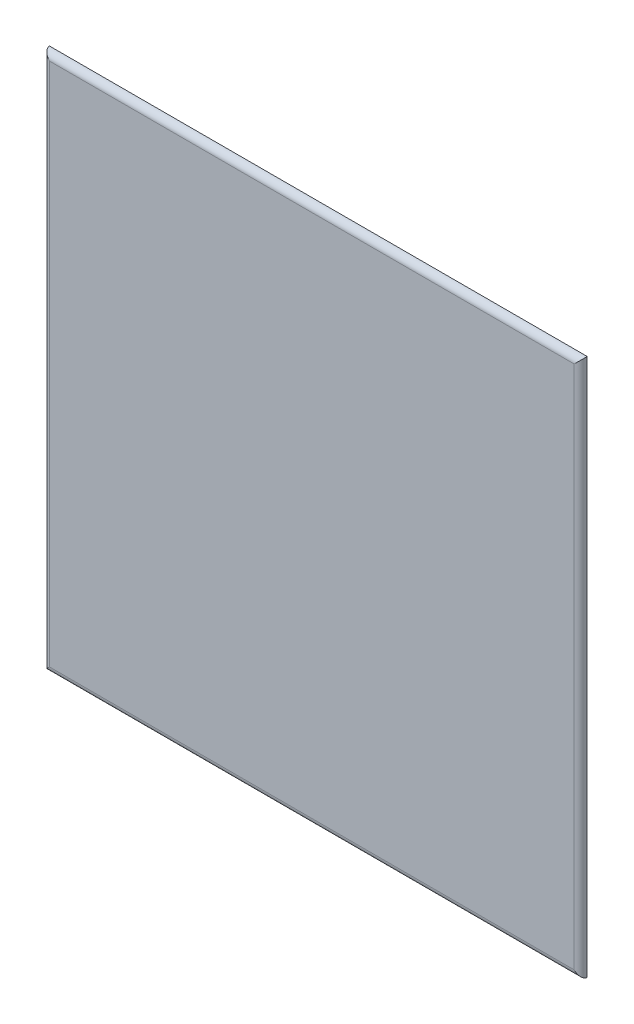
ISO-10303-21;
HEADER;
FILE_DESCRIPTION(('STEP AP214'),'2;1');
FILE_NAME('part.step','',(''),(''),'','','');
FILE_SCHEMA(('AUTOMOTIVE_DESIGN { 1 0 10303 214 1 1 1 1 }'));
ENDSEC;
DATA;
#1=APPLICATION_CONTEXT('core data for automotive mechanical design processes');
#2=APPLICATION_PROTOCOL_DEFINITION('international standard','automotive_design',2000,#1);
#3=PRODUCT_CONTEXT('',#1,'mechanical');
#4=PRODUCT('Part','Part','',(#3));
#5=PRODUCT_RELATED_PRODUCT_CATEGORY('part','',(#4));
#6=PRODUCT_DEFINITION_FORMATION('','',#4);
#7=PRODUCT_DEFINITION_CONTEXT('part definition',#1,'design');
#8=PRODUCT_DEFINITION('design','',#6,#7);
#9=PRODUCT_DEFINITION_SHAPE('','',#8);
#10=(LENGTH_UNIT() NAMED_UNIT(*) SI_UNIT(.MILLI.,.METRE.));
#11=(NAMED_UNIT(*) PLANE_ANGLE_UNIT() SI_UNIT($,.RADIAN.));
#12=(NAMED_UNIT(*) SI_UNIT($,.STERADIAN.) SOLID_ANGLE_UNIT());
#13=UNCERTAINTY_MEASURE_WITH_UNIT(LENGTH_MEASURE(1.E-05),#10,'distance_accuracy_value','');
#14=(GEOMETRIC_REPRESENTATION_CONTEXT(3) GLOBAL_UNCERTAINTY_ASSIGNED_CONTEXT((#13)) GLOBAL_UNIT_ASSIGNED_CONTEXT((#10,
#11,#12)) REPRESENTATION_CONTEXT('',''));
#15=CARTESIAN_POINT('',(0.,0.,0.));
#16=DIRECTION('',(0.,0.,1.));
#17=DIRECTION('',(1.,0.,0.));
#18=AXIS2_PLACEMENT_3D('',#15,#16,#17);
#19=CARTESIAN_POINT('',(74.75,-74.75,3.));
#20=DIRECTION('',(-1.,0.,0.));
#21=DIRECTION('',(0.,0.,1.));
#22=AXIS2_PLACEMENT_3D('',#19,#20,#21);
#23=PLANE('',#22);
#24=DIRECTION('',(0.,1.,0.));
#25=VECTOR('',#24,1.);
#26=CARTESIAN_POINT('',(74.75,-74.75,0.));
#27=LINE('',#26,#25);
#28=CARTESIAN_POINT('',(74.75,-73.75,0.));
#29=VERTEX_POINT('',#28);
#30=CARTESIAN_POINT('',(74.75,73.75,0.));
#31=VERTEX_POINT('',#30);
#32=EDGE_CURVE('E152',#29,#31,#27,.T.);
#33=ORIENTED_EDGE('',*,*,#32,.T.);
#34=DIRECTION('',(0.,0.,-1.));
#35=VECTOR('',#34,1.);
#36=CARTESIAN_POINT('',(74.75,73.75,3.));
#37=LINE('',#36,#35);
#38=CARTESIAN_POINT('',(74.75,73.75,3.));
#39=VERTEX_POINT('',#38);
#40=EDGE_CURVE('E193',#31,#39,#37,.F.);
#41=ORIENTED_EDGE('',*,*,#40,.T.);
#42=DIRECTION('',(0.,1.,0.));
#43=VECTOR('',#42,1.);
#44=CARTESIAN_POINT('',(74.75,-74.75,3.));
#45=LINE('',#44,#43);
#46=CARTESIAN_POINT('',(74.75,-73.75,3.));
#47=VERTEX_POINT('',#46);
#48=EDGE_CURVE('E158',#47,#39,#45,.T.);
#49=ORIENTED_EDGE('',*,*,#48,.F.);
#50=DIRECTION('',(0.,0.,-1.));
#51=VECTOR('',#50,1.);
#52=CARTESIAN_POINT('',(74.75,-73.75,3.));
#53=LINE('',#52,#51);
#54=EDGE_CURVE('E195',#47,#29,#53,.T.);
#55=ORIENTED_EDGE('',*,*,#54,.T.);
#56=EDGE_LOOP('',(#33,#41,#49,#55));
#57=FACE_BOUND('',#56,.T.);
#58=ADVANCED_FACE('F41',(#57),#23,.F.);
#59=CARTESIAN_POINT('',(-74.75,74.75,3.));
#60=DIRECTION('',(0.,-1.,0.));
#61=DIRECTION('',(0.,0.,-1.));
#62=AXIS2_PLACEMENT_3D('',#59,#60,#61);
#63=PLANE('',#62);
#64=DIRECTION('',(-1.,0.,0.));
#65=VECTOR('',#64,1.);
#66=CARTESIAN_POINT('',(-74.75,74.75,3.));
#67=LINE('',#66,#65);
#68=CARTESIAN_POINT('',(73.75,74.75,3.));
#69=VERTEX_POINT('',#68);
#70=CARTESIAN_POINT('',(-73.75,74.75,3.));
#71=VERTEX_POINT('',#70);
#72=EDGE_CURVE('E159',#69,#71,#67,.T.);
#73=ORIENTED_EDGE('',*,*,#72,.F.);
#74=DIRECTION('',(0.,0.,-1.));
#75=VECTOR('',#74,1.);
#76=CARTESIAN_POINT('',(73.75,74.75,3.));
#77=LINE('',#76,#75);
#78=CARTESIAN_POINT('',(73.75,74.75,0.));
#79=VERTEX_POINT('',#78);
#80=EDGE_CURVE('E181',#69,#79,#77,.T.);
#81=ORIENTED_EDGE('',*,*,#80,.T.);
#82=DIRECTION('',(-1.,0.,0.));
#83=VECTOR('',#82,1.);
#84=CARTESIAN_POINT('',(-74.75,74.75,0.));
#85=LINE('',#84,#83);
#86=CARTESIAN_POINT('',(-73.75,74.75,0.));
#87=VERTEX_POINT('',#86);
#88=EDGE_CURVE('E175',#79,#87,#85,.T.);
#89=ORIENTED_EDGE('',*,*,#88,.T.);
#90=DIRECTION('',(0.,0.,-1.));
#91=VECTOR('',#90,1.);
#92=CARTESIAN_POINT('',(-73.75,74.75,3.));
#93=LINE('',#92,#91);
#94=EDGE_CURVE('E169',#87,#71,#93,.F.);
#95=ORIENTED_EDGE('',*,*,#94,.T.);
#96=EDGE_LOOP('',(#73,#81,#89,#95));
#97=FACE_BOUND('',#96,.T.);
#98=ADVANCED_FACE('F231',(#97),#63,.F.);
#99=CARTESIAN_POINT('',(-74.75,-74.75,3.));
#100=DIRECTION('',(1.,0.,0.));
#101=DIRECTION('',(0.,0.,-1.));
#102=AXIS2_PLACEMENT_3D('',#99,#100,#101);
#103=PLANE('',#102);
#104=DIRECTION('',(0.,-1.,0.));
#105=VECTOR('',#104,1.);
#106=CARTESIAN_POINT('',(-74.75,-74.75,3.));
#107=LINE('',#106,#105);
#108=CARTESIAN_POINT('',(-74.75,73.75,3.));
#109=VERTEX_POINT('',#108);
#110=CARTESIAN_POINT('',(-74.75,-73.75,3.));
#111=VERTEX_POINT('',#110);
#112=EDGE_CURVE('E161',#109,#111,#107,.T.);
#113=ORIENTED_EDGE('',*,*,#112,.F.);
#114=DIRECTION('',(0.,0.,-1.));
#115=VECTOR('',#114,1.);
#116=CARTESIAN_POINT('',(-74.75,73.75,3.));
#117=LINE('',#116,#115);
#118=CARTESIAN_POINT('',(-74.75,73.75,0.));
#119=VERTEX_POINT('',#118);
#120=EDGE_CURVE('E198',#109,#119,#117,.T.);
#121=ORIENTED_EDGE('',*,*,#120,.T.);
#122=DIRECTION('',(0.,-1.,0.));
#123=VECTOR('',#122,1.);
#124=CARTESIAN_POINT('',(-74.75,-74.75,0.));
#125=LINE('',#124,#123);
#126=CARTESIAN_POINT('',(-74.75,-73.75,0.));
#127=VERTEX_POINT('',#126);
#128=EDGE_CURVE('E174',#119,#127,#125,.T.);
#129=ORIENTED_EDGE('',*,*,#128,.T.);
#130=DIRECTION('',(0.,0.,-1.));
#131=VECTOR('',#130,1.);
#132=CARTESIAN_POINT('',(-74.75,-73.75,3.));
#133=LINE('',#132,#131);
#134=EDGE_CURVE('E196',#127,#111,#133,.F.);
#135=ORIENTED_EDGE('',*,*,#134,.T.);
#136=EDGE_LOOP('',(#113,#121,#129,#135));
#137=FACE_BOUND('',#136,.T.);
#138=ADVANCED_FACE('F237',(#137),#103,.F.);
#139=CARTESIAN_POINT('',(-74.75,-74.75,3.));
#140=DIRECTION('',(0.,1.,0.));
#141=DIRECTION('',(0.,0.,1.));
#142=AXIS2_PLACEMENT_3D('',#139,#140,#141);
#143=PLANE('',#142);
#144=DIRECTION('',(1.,0.,0.));
#145=VECTOR('',#144,1.);
#146=CARTESIAN_POINT('',(-74.75,-74.75,3.));
#147=LINE('',#146,#145);
#148=CARTESIAN_POINT('',(-73.75,-74.75,3.));
#149=VERTEX_POINT('',#148);
#150=CARTESIAN_POINT('',(73.75,-74.75,3.));
#151=VERTEX_POINT('',#150);
#152=EDGE_CURVE('E168',#149,#151,#147,.T.);
#153=ORIENTED_EDGE('',*,*,#152,.F.);
#154=DIRECTION('',(0.,0.,-1.));
#155=VECTOR('',#154,1.);
#156=CARTESIAN_POINT('',(-73.75,-74.75,3.));
#157=LINE('',#156,#155);
#158=CARTESIAN_POINT('',(-73.75,-74.75,0.));
#159=VERTEX_POINT('',#158);
#160=EDGE_CURVE('E204',#149,#159,#157,.T.);
#161=ORIENTED_EDGE('',*,*,#160,.T.);
#162=DIRECTION('',(1.,0.,0.));
#163=VECTOR('',#162,1.);
#164=CARTESIAN_POINT('',(-74.75,-74.75,0.));
#165=LINE('',#164,#163);
#166=CARTESIAN_POINT('',(73.75,-74.75,0.));
#167=VERTEX_POINT('',#166);
#168=EDGE_CURVE('E157',#159,#167,#165,.T.);
#169=ORIENTED_EDGE('',*,*,#168,.T.);
#170=DIRECTION('',(0.,0.,-1.));
#171=VECTOR('',#170,1.);
#172=CARTESIAN_POINT('',(73.75,-74.75,3.));
#173=LINE('',#172,#171);
#174=EDGE_CURVE('E205',#167,#151,#173,.F.);
#175=ORIENTED_EDGE('',*,*,#174,.T.);
#176=EDGE_LOOP('',(#153,#161,#169,#175));
#177=FACE_BOUND('',#176,.T.);
#178=ADVANCED_FACE('F328',(#177),#143,.F.);
#179=CARTESIAN_POINT('',(0.,0.,0.));
#180=DIRECTION('',(0.,0.,-1.));
#181=DIRECTION('',(-1.,0.,0.));
#182=AXIS2_PLACEMENT_3D('',#179,#180,#181);
#183=PLANE('',#182);
#184=ORIENTED_EDGE('',*,*,#88,.F.);
#185=CARTESIAN_POINT('',(73.75,73.75,0.));
#186=DIRECTION('',(0.,0.,-1.));
#187=DIRECTION('',(-1.,0.,0.));
#188=AXIS2_PLACEMENT_3D('',#185,#186,#187);
#189=CIRCLE('',#188,1.);
#190=EDGE_CURVE('E188',#79,#31,#189,.T.);
#191=ORIENTED_EDGE('',*,*,#190,.T.);
#192=ORIENTED_EDGE('',*,*,#32,.F.);
#193=CARTESIAN_POINT('',(73.75,-73.75,0.));
#194=DIRECTION('',(0.,0.,-1.));
#195=DIRECTION('',(-1.,0.,0.));
#196=AXIS2_PLACEMENT_3D('',#193,#194,#195);
#197=CIRCLE('',#196,1.);
#198=EDGE_CURVE('E183',#29,#167,#197,.T.);
#199=ORIENTED_EDGE('',*,*,#198,.T.);
#200=ORIENTED_EDGE('',*,*,#168,.F.);
#201=CARTESIAN_POINT('',(-73.75,-73.75,0.));
#202=DIRECTION('',(0.,0.,-1.));
#203=DIRECTION('',(-1.,0.,0.));
#204=AXIS2_PLACEMENT_3D('',#201,#202,#203);
#205=CIRCLE('',#204,1.);
#206=EDGE_CURVE('E187',#159,#127,#205,.T.);
#207=ORIENTED_EDGE('',*,*,#206,.T.);
#208=ORIENTED_EDGE('',*,*,#128,.F.);
#209=CARTESIAN_POINT('',(-73.75,73.75,0.));
#210=DIRECTION('',(0.,0.,-1.));
#211=DIRECTION('',(-1.,0.,0.));
#212=AXIS2_PLACEMENT_3D('',#209,#210,#211);
#213=CIRCLE('',#212,1.);
#214=EDGE_CURVE('E189',#119,#87,#213,.T.);
#215=ORIENTED_EDGE('',*,*,#214,.T.);
#216=EDGE_LOOP('',(#184,#191,#192,#199,#200,#207,#208,#215));
#217=FACE_BOUND('',#216,.T.);
#218=ADVANCED_FACE('F322',(#217),#183,.T.);
#219=CARTESIAN_POINT('',(0.,0.,3.));
#220=DIRECTION('',(0.,0.,1.));
#221=DIRECTION('',(1.,0.,0.));
#222=AXIS2_PLACEMENT_3D('',#219,#220,#221);
#223=PLANE('',#222);
#224=DIRECTION('',(0.,1.,0.));
#225=VECTOR('',#224,1.);
#226=CARTESIAN_POINT('',(82.5,82.5,3.));
#227=LINE('',#226,#225);
#228=CARTESIAN_POINT('',(82.5,-82.5,3.));
#229=VERTEX_POINT('',#228);
#230=CARTESIAN_POINT('',(82.5,82.5,3.));
#231=VERTEX_POINT('',#230);
#232=EDGE_CURVE('E132',#229,#231,#227,.T.);
#233=ORIENTED_EDGE('',*,*,#232,.F.);
#234=DIRECTION('',(1.,0.,0.));
#235=VECTOR('',#234,1.);
#236=CARTESIAN_POINT('',(-82.5,-82.5,3.));
#237=LINE('',#236,#235);
#238=CARTESIAN_POINT('',(-82.5,-82.5,3.));
#239=VERTEX_POINT('',#238);
#240=EDGE_CURVE('E155',#239,#229,#237,.T.);
#241=ORIENTED_EDGE('',*,*,#240,.F.);
#242=DIRECTION('',(0.,-1.,0.));
#243=VECTOR('',#242,1.);
#244=CARTESIAN_POINT('',(-82.5,82.5,3.));
#245=LINE('',#244,#243);
#246=CARTESIAN_POINT('',(-82.5,82.5,3.));
#247=VERTEX_POINT('',#246);
#248=EDGE_CURVE('E136',#247,#239,#245,.T.);
#249=ORIENTED_EDGE('',*,*,#248,.F.);
#250=DIRECTION('',(-1.,0.,0.));
#251=VECTOR('',#250,1.);
#252=CARTESIAN_POINT('',(-82.5,82.5,3.));
#253=LINE('',#252,#251);
#254=EDGE_CURVE('E126',#231,#247,#253,.T.);
#255=ORIENTED_EDGE('',*,*,#254,.F.);
#256=EDGE_LOOP('',(#233,#241,#249,#255));
#257=FACE_BOUND('',#256,.T.);
#258=ORIENTED_EDGE('',*,*,#112,.T.);
#259=CARTESIAN_POINT('',(-73.75,-73.75,3.));
#260=DIRECTION('',(0.,0.,1.));
#261=DIRECTION('',(1.,0.,0.));
#262=AXIS2_PLACEMENT_3D('',#259,#260,#261);
#263=CIRCLE('',#262,1.);
#264=EDGE_CURVE('E212',#111,#149,#263,.T.);
#265=ORIENTED_EDGE('',*,*,#264,.T.);
#266=ORIENTED_EDGE('',*,*,#152,.T.);
#267=CARTESIAN_POINT('',(73.75,-73.75,3.));
#268=DIRECTION('',(0.,0.,1.));
#269=DIRECTION('',(1.,0.,0.));
#270=AXIS2_PLACEMENT_3D('',#267,#268,#269);
#271=CIRCLE('',#270,1.);
#272=EDGE_CURVE('E214',#151,#47,#271,.T.);
#273=ORIENTED_EDGE('',*,*,#272,.T.);
#274=ORIENTED_EDGE('',*,*,#48,.T.);
#275=CARTESIAN_POINT('',(73.75,73.75,3.));
#276=DIRECTION('',(0.,0.,1.));
#277=DIRECTION('',(1.,0.,0.));
#278=AXIS2_PLACEMENT_3D('',#275,#276,#277);
#279=CIRCLE('',#278,1.);
#280=EDGE_CURVE('E210',#39,#69,#279,.T.);
#281=ORIENTED_EDGE('',*,*,#280,.T.);
#282=ORIENTED_EDGE('',*,*,#72,.T.);
#283=CARTESIAN_POINT('',(-73.75,73.75,3.));
#284=DIRECTION('',(0.,0.,1.));
#285=DIRECTION('',(1.,0.,0.));
#286=AXIS2_PLACEMENT_3D('',#283,#284,#285);
#287=CIRCLE('',#286,1.);
#288=EDGE_CURVE('E209',#71,#109,#287,.T.);
#289=ORIENTED_EDGE('',*,*,#288,.T.);
#290=EDGE_LOOP('',(#258,#265,#266,#273,#274,#281,#282,#289));
#291=FACE_BOUND('',#290,.T.);
#292=ADVANCED_FACE('F134',(#257,#291),#223,.F.);
#293=CARTESIAN_POINT('',(0.,0.,5.));
#294=DIRECTION('',(0.,0.,1.));
#295=DIRECTION('',(1.,0.,0.));
#296=AXIS2_PLACEMENT_3D('',#293,#294,#295);
#297=PLANE('',#296);
#298=DIRECTION('',(0.,-1.,0.));
#299=VECTOR('',#298,1.);
#300=CARTESIAN_POINT('',(-80.5,-82.5,5.));
#301=LINE('',#300,#299);
#302=CARTESIAN_POINT('',(-80.5,80.5,5.));
#303=VERTEX_POINT('',#302);
#304=CARTESIAN_POINT('',(-80.5,-80.5,5.));
#305=VERTEX_POINT('',#304);
#306=EDGE_CURVE('E49',#303,#305,#301,.T.);
#307=ORIENTED_EDGE('',*,*,#306,.T.);
#308=DIRECTION('',(1.,0.,0.));
#309=VECTOR('',#308,1.);
#310=CARTESIAN_POINT('',(82.5,-80.5,5.));
#311=LINE('',#310,#309);
#312=CARTESIAN_POINT('',(80.5,-80.5,5.));
#313=VERTEX_POINT('',#312);
#314=EDGE_CURVE('E11',#305,#313,#311,.T.);
#315=ORIENTED_EDGE('',*,*,#314,.T.);
#316=DIRECTION('',(0.,1.,0.));
#317=VECTOR('',#316,1.);
#318=CARTESIAN_POINT('',(80.5,82.5,5.));
#319=LINE('',#318,#317);
#320=CARTESIAN_POINT('',(80.5,80.5,5.));
#321=VERTEX_POINT('',#320);
#322=EDGE_CURVE('E213',#313,#321,#319,.T.);
#323=ORIENTED_EDGE('',*,*,#322,.T.);
#324=DIRECTION('',(-1.,0.,0.));
#325=VECTOR('',#324,1.);
#326=CARTESIAN_POINT('',(-82.5,80.5,5.));
#327=LINE('',#326,#325);
#328=EDGE_CURVE('E62',#321,#303,#327,.T.);
#329=ORIENTED_EDGE('',*,*,#328,.T.);
#330=EDGE_LOOP('',(#307,#315,#323,#329));
#331=FACE_BOUND('',#330,.T.);
#332=ADVANCED_FACE('F247',(#331),#297,.T.);
#333=CARTESIAN_POINT('',(73.75,73.75,3.));
#334=DIRECTION('',(0.,0.,-1.));
#335=DIRECTION('',(-1.,0.,0.));
#336=AXIS2_PLACEMENT_3D('',#333,#334,#335);
#337=CYLINDRICAL_SURFACE('',#336,1.);
#338=ORIENTED_EDGE('',*,*,#280,.F.);
#339=ORIENTED_EDGE('',*,*,#40,.F.);
#340=ORIENTED_EDGE('',*,*,#190,.F.);
#341=ORIENTED_EDGE('',*,*,#80,.F.);
#342=EDGE_LOOP('',(#338,#339,#340,#341));
#343=FACE_BOUND('',#342,.T.);
#344=ADVANCED_FACE('F242',(#343),#337,.T.);
#345=CARTESIAN_POINT('',(-73.75,73.75,3.));
#346=DIRECTION('',(0.,0.,-1.));
#347=DIRECTION('',(-1.,0.,0.));
#348=AXIS2_PLACEMENT_3D('',#345,#346,#347);
#349=CYLINDRICAL_SURFACE('',#348,1.);
#350=ORIENTED_EDGE('',*,*,#288,.F.);
#351=ORIENTED_EDGE('',*,*,#94,.F.);
#352=ORIENTED_EDGE('',*,*,#214,.F.);
#353=ORIENTED_EDGE('',*,*,#120,.F.);
#354=EDGE_LOOP('',(#350,#351,#352,#353));
#355=FACE_BOUND('',#354,.T.);
#356=ADVANCED_FACE('F250',(#355),#349,.T.);
#357=CARTESIAN_POINT('',(-73.75,-73.75,3.));
#358=DIRECTION('',(0.,0.,-1.));
#359=DIRECTION('',(-1.,0.,0.));
#360=AXIS2_PLACEMENT_3D('',#357,#358,#359);
#361=CYLINDRICAL_SURFACE('',#360,1.);
#362=ORIENTED_EDGE('',*,*,#264,.F.);
#363=ORIENTED_EDGE('',*,*,#134,.F.);
#364=ORIENTED_EDGE('',*,*,#206,.F.);
#365=ORIENTED_EDGE('',*,*,#160,.F.);
#366=EDGE_LOOP('',(#362,#363,#364,#365));
#367=FACE_BOUND('',#366,.T.);
#368=ADVANCED_FACE('F255',(#367),#361,.T.);
#369=CARTESIAN_POINT('',(73.75,-73.75,3.));
#370=DIRECTION('',(0.,0.,-1.));
#371=DIRECTION('',(-1.,0.,0.));
#372=AXIS2_PLACEMENT_3D('',#369,#370,#371);
#373=CYLINDRICAL_SURFACE('',#372,1.);
#374=ORIENTED_EDGE('',*,*,#272,.F.);
#375=ORIENTED_EDGE('',*,*,#174,.F.);
#376=ORIENTED_EDGE('',*,*,#198,.F.);
#377=ORIENTED_EDGE('',*,*,#54,.F.);
#378=EDGE_LOOP('',(#374,#375,#376,#377));
#379=FACE_BOUND('',#378,.T.);
#380=ADVANCED_FACE('F233',(#379),#373,.T.);
#381=CARTESIAN_POINT('',(0.,80.5,3.));
#382=DIRECTION('',(1.,0.,0.));
#383=DIRECTION('',(0.,0.,-1.));
#384=AXIS2_PLACEMENT_3D('',#381,#382,#383);
#385=CYLINDRICAL_SURFACE('',#384,2.);
#386=CARTESIAN_POINT('',(80.5,80.5,3.));
#387=DIRECTION('',(0.707106781186547,-0.707106781186547,0.));
#388=DIRECTION('',(-0.707106781186547,-0.707106781186548,0.));
#389=AXIS2_PLACEMENT_3D('',#386,#387,#388);
#390=ELLIPSE('',#389,2.82842712474619,2.);
#391=EDGE_CURVE('E141',#231,#321,#390,.T.);
#392=ORIENTED_EDGE('',*,*,#391,.F.);
#393=ORIENTED_EDGE('',*,*,#254,.T.);
#394=CARTESIAN_POINT('',(-80.5,80.5,3.));
#395=DIRECTION('',(0.707106781186547,0.707106781186548,0.));
#396=DIRECTION('',(0.707106781186548,-0.707106781186547,0.));
#397=AXIS2_PLACEMENT_3D('',#394,#395,#396);
#398=ELLIPSE('',#397,2.82842712474619,2.);
#399=EDGE_CURVE('E44',#303,#247,#398,.F.);
#400=ORIENTED_EDGE('',*,*,#399,.F.);
#401=ORIENTED_EDGE('',*,*,#328,.F.);
#402=EDGE_LOOP('',(#392,#393,#400,#401));
#403=FACE_BOUND('',#402,.T.);
#404=ADVANCED_FACE('F43',(#403),#385,.T.);
#405=CARTESIAN_POINT('',(-80.5,0.,3.));
#406=DIRECTION('',(0.,1.,0.));
#407=DIRECTION('',(-1.,0.,0.));
#408=AXIS2_PLACEMENT_3D('',#405,#406,#407);
#409=CYLINDRICAL_SURFACE('',#408,2.);
#410=ORIENTED_EDGE('',*,*,#399,.T.);
#411=ORIENTED_EDGE('',*,*,#248,.T.);
#412=CARTESIAN_POINT('',(-80.5,-80.5,3.));
#413=DIRECTION('',(-0.707106781186548,0.707106781186547,0.));
#414=DIRECTION('',(0.707106781186547,0.707106781186548,0.));
#415=AXIS2_PLACEMENT_3D('',#412,#413,#414);
#416=ELLIPSE('',#415,2.82842712474619,2.);
#417=EDGE_CURVE('E147',#305,#239,#416,.F.);
#418=ORIENTED_EDGE('',*,*,#417,.F.);
#419=ORIENTED_EDGE('',*,*,#306,.F.);
#420=EDGE_LOOP('',(#410,#411,#418,#419));
#421=FACE_BOUND('',#420,.T.);
#422=ADVANCED_FACE('F224',(#421),#409,.T.);
#423=CARTESIAN_POINT('',(80.5,0.,3.));
#424=DIRECTION('',(0.,-1.,0.));
#425=DIRECTION('',(1.,0.,0.));
#426=AXIS2_PLACEMENT_3D('',#423,#424,#425);
#427=CYLINDRICAL_SURFACE('',#426,2.);
#428=ORIENTED_EDGE('',*,*,#391,.T.);
#429=ORIENTED_EDGE('',*,*,#322,.F.);
#430=CARTESIAN_POINT('',(80.5,-80.5,3.));
#431=DIRECTION('',(-0.707106781186547,-0.707106781186548,0.));
#432=DIRECTION('',(0.707106781186547,-0.707106781186547,0.));
#433=AXIS2_PLACEMENT_3D('',#430,#431,#432);
#434=ELLIPSE('',#433,2.82842712474619,2.);
#435=EDGE_CURVE('E146',#229,#313,#434,.T.);
#436=ORIENTED_EDGE('',*,*,#435,.F.);
#437=ORIENTED_EDGE('',*,*,#232,.T.);
#438=EDGE_LOOP('',(#428,#429,#436,#437));
#439=FACE_BOUND('',#438,.T.);
#440=ADVANCED_FACE('F149',(#439),#427,.T.);
#441=CARTESIAN_POINT('',(0.,-80.5,3.));
#442=DIRECTION('',(-1.,0.,0.));
#443=DIRECTION('',(0.,0.,1.));
#444=AXIS2_PLACEMENT_3D('',#441,#442,#443);
#445=CYLINDRICAL_SURFACE('',#444,2.);
#446=ORIENTED_EDGE('',*,*,#417,.T.);
#447=ORIENTED_EDGE('',*,*,#240,.T.);
#448=ORIENTED_EDGE('',*,*,#435,.T.);
#449=ORIENTED_EDGE('',*,*,#314,.F.);
#450=EDGE_LOOP('',(#446,#447,#448,#449));
#451=FACE_BOUND('',#450,.T.);
#452=ADVANCED_FACE('F225',(#451),#445,.T.);
#453=CLOSED_SHELL('',(#58,#98,#138,#178,#218,#292,#332,#344,#356,#368,#380,#404,#422,#440,#452));
#454=MANIFOLD_SOLID_BREP('B2',#453);
#455=ADVANCED_BREP_SHAPE_REPRESENTATION('',(#18,#454),#14);
#456=SHAPE_DEFINITION_REPRESENTATION(#9,#455);
ENDSEC;
END-ISO-10303-21;
